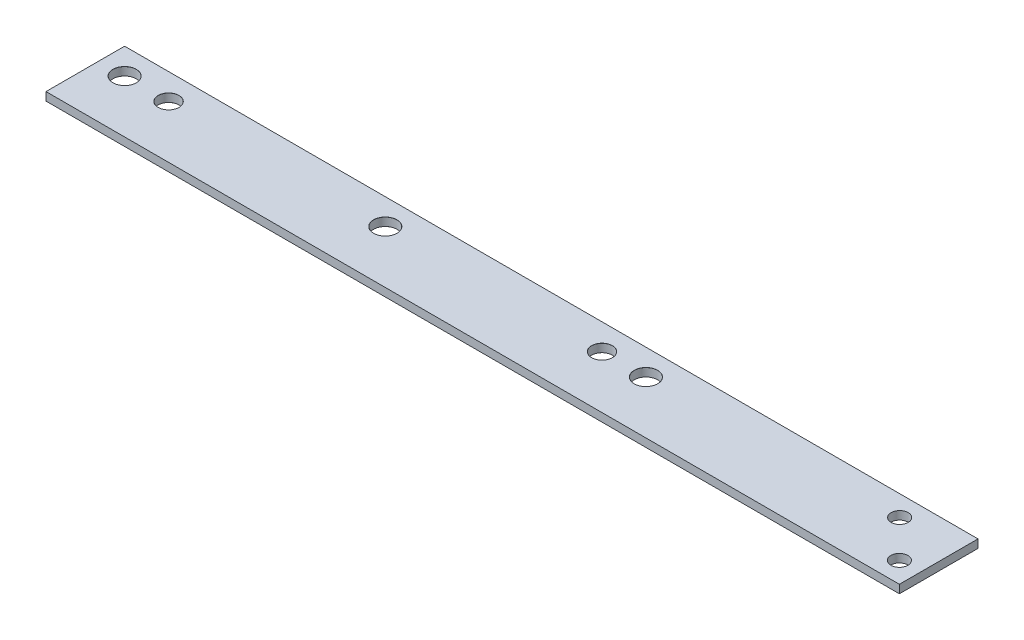
ISO-10303-21;
HEADER;
FILE_DESCRIPTION(('STEP AP214'),'2;1');
FILE_NAME('part.step','',(''),(''),'','','');
FILE_SCHEMA(('AUTOMOTIVE_DESIGN { 1 0 10303 214 1 1 1 1 }'));
ENDSEC;
DATA;
#1=APPLICATION_CONTEXT('core data for automotive mechanical design processes');
#2=APPLICATION_PROTOCOL_DEFINITION('international standard','automotive_design',2000,#1);
#3=PRODUCT_CONTEXT('',#1,'mechanical');
#4=PRODUCT('Part','Part','',(#3));
#5=PRODUCT_RELATED_PRODUCT_CATEGORY('part','',(#4));
#6=PRODUCT_DEFINITION_FORMATION('','',#4);
#7=PRODUCT_DEFINITION_CONTEXT('part definition',#1,'design');
#8=PRODUCT_DEFINITION('design','',#6,#7);
#9=PRODUCT_DEFINITION_SHAPE('','',#8);
#10=(LENGTH_UNIT() NAMED_UNIT(*) SI_UNIT(.MILLI.,.METRE.));
#11=(NAMED_UNIT(*) PLANE_ANGLE_UNIT() SI_UNIT($,.RADIAN.));
#12=(NAMED_UNIT(*) SI_UNIT($,.STERADIAN.) SOLID_ANGLE_UNIT());
#13=UNCERTAINTY_MEASURE_WITH_UNIT(LENGTH_MEASURE(1.E-05),#10,'distance_accuracy_value','');
#14=(GEOMETRIC_REPRESENTATION_CONTEXT(3) GLOBAL_UNCERTAINTY_ASSIGNED_CONTEXT((#13)) GLOBAL_UNIT_ASSIGNED_CONTEXT((#10,
#11,#12)) REPRESENTATION_CONTEXT('',''));
#15=CARTESIAN_POINT('',(0.,0.,0.));
#16=DIRECTION('',(0.,0.,1.));
#17=DIRECTION('',(1.,0.,0.));
#18=AXIS2_PLACEMENT_3D('',#15,#16,#17);
#19=CARTESIAN_POINT('',(165.,-3.2,-15.2));
#20=DIRECTION('',(1.,0.,0.));
#21=DIRECTION('',(0.,0.,-1.));
#22=AXIS2_PLACEMENT_3D('',#19,#20,#21);
#23=PLANE('',#22);
#24=DIRECTION('',(0.,0.,-1.));
#25=VECTOR('',#24,1.);
#26=CARTESIAN_POINT('',(165.,0.,-15.2));
#27=LINE('',#26,#25);
#28=CARTESIAN_POINT('',(165.,0.,15.2));
#29=VERTEX_POINT('',#28);
#30=CARTESIAN_POINT('',(165.,0.,-15.2));
#31=VERTEX_POINT('',#30);
#32=EDGE_CURVE('E115',#29,#31,#27,.T.);
#33=ORIENTED_EDGE('',*,*,#32,.F.);
#34=DIRECTION('',(0.,1.,0.));
#35=VECTOR('',#34,1.);
#36=CARTESIAN_POINT('',(165.,-3.2,15.2));
#37=LINE('',#36,#35);
#38=CARTESIAN_POINT('',(165.,-3.2,15.2));
#39=VERTEX_POINT('',#38);
#40=EDGE_CURVE('E11',#39,#29,#37,.T.);
#41=ORIENTED_EDGE('',*,*,#40,.F.);
#42=DIRECTION('',(0.,0.,-1.));
#43=VECTOR('',#42,1.);
#44=CARTESIAN_POINT('',(165.,-3.2,-15.2));
#45=LINE('',#44,#43);
#46=CARTESIAN_POINT('',(165.,-3.2,-15.2));
#47=VERTEX_POINT('',#46);
#48=EDGE_CURVE('E105',#39,#47,#45,.T.);
#49=ORIENTED_EDGE('',*,*,#48,.T.);
#50=DIRECTION('',(0.,1.,0.));
#51=VECTOR('',#50,1.);
#52=CARTESIAN_POINT('',(165.,-3.2,-15.2));
#53=LINE('',#52,#51);
#54=EDGE_CURVE('E46',#47,#31,#53,.T.);
#55=ORIENTED_EDGE('',*,*,#54,.T.);
#56=EDGE_LOOP('',(#33,#41,#49,#55));
#57=FACE_BOUND('',#56,.T.);
#58=ADVANCED_FACE('F43',(#57),#23,.T.);
#59=CARTESIAN_POINT('',(-165.,-3.2,15.2));
#60=DIRECTION('',(0.,0.,1.));
#61=DIRECTION('',(1.,0.,0.));
#62=AXIS2_PLACEMENT_3D('',#59,#60,#61);
#63=PLANE('',#62);
#64=DIRECTION('',(1.,0.,0.));
#65=VECTOR('',#64,1.);
#66=CARTESIAN_POINT('',(-165.,0.,15.2));
#67=LINE('',#66,#65);
#68=CARTESIAN_POINT('',(-165.,0.,15.2));
#69=VERTEX_POINT('',#68);
#70=EDGE_CURVE('E109',#69,#29,#67,.T.);
#71=ORIENTED_EDGE('',*,*,#70,.F.);
#72=DIRECTION('',(0.,1.,0.));
#73=VECTOR('',#72,1.);
#74=CARTESIAN_POINT('',(-165.,-3.2,15.2));
#75=LINE('',#74,#73);
#76=CARTESIAN_POINT('',(-165.,-3.2,15.2));
#77=VERTEX_POINT('',#76);
#78=EDGE_CURVE('E53',#77,#69,#75,.T.);
#79=ORIENTED_EDGE('',*,*,#78,.F.);
#80=DIRECTION('',(1.,0.,0.));
#81=VECTOR('',#80,1.);
#82=CARTESIAN_POINT('',(-165.,-3.2,15.2));
#83=LINE('',#82,#81);
#84=EDGE_CURVE('E100',#77,#39,#83,.T.);
#85=ORIENTED_EDGE('',*,*,#84,.T.);
#86=ORIENTED_EDGE('',*,*,#40,.T.);
#87=EDGE_LOOP('',(#71,#79,#85,#86));
#88=FACE_BOUND('',#87,.T.);
#89=ADVANCED_FACE('F138',(#88),#63,.T.);
#90=CARTESIAN_POINT('',(-165.,-3.2,-15.2));
#91=DIRECTION('',(-1.,0.,0.));
#92=DIRECTION('',(0.,0.,1.));
#93=AXIS2_PLACEMENT_3D('',#90,#91,#92);
#94=PLANE('',#93);
#95=DIRECTION('',(0.,0.,1.));
#96=VECTOR('',#95,1.);
#97=CARTESIAN_POINT('',(-165.,0.,-15.2));
#98=LINE('',#97,#96);
#99=CARTESIAN_POINT('',(-165.,0.,-15.2));
#100=VERTEX_POINT('',#99);
#101=EDGE_CURVE('E94',#100,#69,#98,.T.);
#102=ORIENTED_EDGE('',*,*,#101,.F.);
#103=DIRECTION('',(0.,1.,0.));
#104=VECTOR('',#103,1.);
#105=CARTESIAN_POINT('',(-165.,-3.2,-15.2));
#106=LINE('',#105,#104);
#107=CARTESIAN_POINT('',(-165.,-3.2,-15.2));
#108=VERTEX_POINT('',#107);
#109=EDGE_CURVE('E89',#108,#100,#106,.T.);
#110=ORIENTED_EDGE('',*,*,#109,.F.);
#111=DIRECTION('',(0.,0.,1.));
#112=VECTOR('',#111,1.);
#113=CARTESIAN_POINT('',(-165.,-3.2,-15.2));
#114=LINE('',#113,#112);
#115=EDGE_CURVE('E92',#108,#77,#114,.T.);
#116=ORIENTED_EDGE('',*,*,#115,.T.);
#117=ORIENTED_EDGE('',*,*,#78,.T.);
#118=EDGE_LOOP('',(#102,#110,#116,#117));
#119=FACE_BOUND('',#118,.T.);
#120=ADVANCED_FACE('F91',(#119),#94,.T.);
#121=CARTESIAN_POINT('',(-165.,-3.2,-15.2));
#122=DIRECTION('',(0.,0.,-1.));
#123=DIRECTION('',(-1.,0.,0.));
#124=AXIS2_PLACEMENT_3D('',#121,#122,#123);
#125=PLANE('',#124);
#126=DIRECTION('',(-1.,0.,0.));
#127=VECTOR('',#126,1.);
#128=CARTESIAN_POINT('',(-165.,0.,-15.2));
#129=LINE('',#128,#127);
#130=EDGE_CURVE('E119',#31,#100,#129,.T.);
#131=ORIENTED_EDGE('',*,*,#130,.F.);
#132=ORIENTED_EDGE('',*,*,#54,.F.);
#133=DIRECTION('',(-1.,0.,0.));
#134=VECTOR('',#133,1.);
#135=CARTESIAN_POINT('',(-165.,-3.2,-15.2));
#136=LINE('',#135,#134);
#137=EDGE_CURVE('E99',#47,#108,#136,.T.);
#138=ORIENTED_EDGE('',*,*,#137,.T.);
#139=ORIENTED_EDGE('',*,*,#109,.T.);
#140=EDGE_LOOP('',(#131,#132,#138,#139));
#141=FACE_BOUND('',#140,.T.);
#142=ADVANCED_FACE('F103',(#141),#125,.T.);
#143=CARTESIAN_POINT('',(0.,-3.2,0.));
#144=DIRECTION('',(0.,1.,0.));
#145=DIRECTION('',(0.,0.,1.));
#146=AXIS2_PLACEMENT_3D('',#143,#144,#145);
#147=PLANE('',#146);
#148=CARTESIAN_POINT('',(142.7,-3.2,-7.20000000000001));
#149=DIRECTION('',(0.,1.,0.));
#150=DIRECTION('',(0.,0.,1.));
#151=AXIS2_PLACEMENT_3D('',#148,#149,#150);
#152=CIRCLE('',#151,3.3);
#153=CARTESIAN_POINT('',(142.7,-3.2,-3.90000000000001));
#154=VERTEX_POINT('',#153);
#155=EDGE_CURVE('E231',#154,#154,#152,.T.);
#156=ORIENTED_EDGE('',*,*,#155,.T.);
#157=EDGE_LOOP('',(#156));
#158=FACE_BOUND('',#157,.T.);
#159=CARTESIAN_POINT('',(157.,-3.2,7.2));
#160=DIRECTION('',(0.,1.,0.));
#161=DIRECTION('',(0.,0.,1.));
#162=AXIS2_PLACEMENT_3D('',#159,#160,#161);
#163=CIRCLE('',#162,3.3);
#164=CARTESIAN_POINT('',(157.,-3.2,10.5));
#165=VERTEX_POINT('',#164);
#166=EDGE_CURVE('E245',#165,#165,#163,.T.);
#167=ORIENTED_EDGE('',*,*,#166,.T.);
#168=EDGE_LOOP('',(#167));
#169=FACE_BOUND('',#168,.T.);
#170=CARTESIAN_POINT('',(-138.,-3.2,-5.20000000000001));
#171=DIRECTION('',(0.,1.,0.));
#172=DIRECTION('',(0.,0.,1.));
#173=AXIS2_PLACEMENT_3D('',#170,#171,#172);
#174=CIRCLE('',#173,4.025);
#175=CARTESIAN_POINT('',(-138.,-3.2,-1.17500000000001));
#176=VERTEX_POINT('',#175);
#177=EDGE_CURVE('E249',#176,#176,#174,.T.);
#178=ORIENTED_EDGE('',*,*,#177,.T.);
#179=EDGE_LOOP('',(#178));
#180=FACE_BOUND('',#179,.T.);
#181=CARTESIAN_POINT('',(29.6,-3.2,-5.2));
#182=DIRECTION('',(0.,1.,0.));
#183=DIRECTION('',(0.,0.,1.));
#184=AXIS2_PLACEMENT_3D('',#181,#182,#183);
#185=CIRCLE('',#184,4.025);
#186=CARTESIAN_POINT('',(29.6,-3.2,-1.175));
#187=VERTEX_POINT('',#186);
#188=EDGE_CURVE('E265',#187,#187,#185,.T.);
#189=ORIENTED_EDGE('',*,*,#188,.T.);
#190=EDGE_LOOP('',(#189));
#191=FACE_BOUND('',#190,.T.);
#192=CARTESIAN_POINT('',(-155.,-3.2,-5.2));
#193=DIRECTION('',(0.,1.,0.));
#194=DIRECTION('',(0.,0.,1.));
#195=AXIS2_PLACEMENT_3D('',#192,#193,#194);
#196=CIRCLE('',#195,4.525);
#197=CARTESIAN_POINT('',(-155.,-3.2,-0.674999999999995));
#198=VERTEX_POINT('',#197);
#199=EDGE_CURVE('E281',#198,#198,#196,.T.);
#200=ORIENTED_EDGE('',*,*,#199,.T.);
#201=EDGE_LOOP('',(#200));
#202=FACE_BOUND('',#201,.T.);
#203=CARTESIAN_POINT('',(46.6,-3.2,-5.2));
#204=DIRECTION('',(0.,1.,0.));
#205=DIRECTION('',(0.,0.,1.));
#206=AXIS2_PLACEMENT_3D('',#203,#204,#205);
#207=CIRCLE('',#206,4.525);
#208=CARTESIAN_POINT('',(46.6,-3.2,-0.674999999999995));
#209=VERTEX_POINT('',#208);
#210=EDGE_CURVE('E297',#209,#209,#207,.T.);
#211=ORIENTED_EDGE('',*,*,#210,.T.);
#212=EDGE_LOOP('',(#211));
#213=FACE_BOUND('',#212,.T.);
#214=CARTESIAN_POINT('',(-54.2,-3.2,-5.2));
#215=DIRECTION('',(0.,1.,0.));
#216=DIRECTION('',(0.,0.,1.));
#217=AXIS2_PLACEMENT_3D('',#214,#215,#216);
#218=CIRCLE('',#217,4.525);
#219=CARTESIAN_POINT('',(-54.2,-3.2,-0.674999999999995));
#220=VERTEX_POINT('',#219);
#221=EDGE_CURVE('E313',#220,#220,#218,.T.);
#222=ORIENTED_EDGE('',*,*,#221,.T.);
#223=EDGE_LOOP('',(#222));
#224=FACE_BOUND('',#223,.T.);
#225=ORIENTED_EDGE('',*,*,#48,.F.);
#226=ORIENTED_EDGE('',*,*,#84,.F.);
#227=ORIENTED_EDGE('',*,*,#115,.F.);
#228=ORIENTED_EDGE('',*,*,#137,.F.);
#229=EDGE_LOOP('',(#225,#226,#227,#228));
#230=FACE_BOUND('',#229,.T.);
#231=ADVANCED_FACE('F98',(#158,#169,#180,#191,#202,#213,#224,#230),#147,.F.);
#232=CARTESIAN_POINT('',(0.,0.,0.));
#233=DIRECTION('',(0.,1.,0.));
#234=DIRECTION('',(0.,0.,1.));
#235=AXIS2_PLACEMENT_3D('',#232,#233,#234);
#236=PLANE('',#235);
#237=CARTESIAN_POINT('',(142.7,0.,-7.20000000000001));
#238=DIRECTION('',(0.,1.,0.));
#239=DIRECTION('',(0.,0.,1.));
#240=AXIS2_PLACEMENT_3D('',#237,#238,#239);
#241=CIRCLE('',#240,3.3);
#242=CARTESIAN_POINT('',(142.7,0.,-3.90000000000001));
#243=VERTEX_POINT('',#242);
#244=EDGE_CURVE('E234',#243,#243,#241,.T.);
#245=ORIENTED_EDGE('',*,*,#244,.F.);
#246=EDGE_LOOP('',(#245));
#247=FACE_BOUND('',#246,.T.);
#248=CARTESIAN_POINT('',(157.,0.,7.2));
#249=DIRECTION('',(0.,1.,0.));
#250=DIRECTION('',(0.,0.,1.));
#251=AXIS2_PLACEMENT_3D('',#248,#249,#250);
#252=CIRCLE('',#251,3.3);
#253=CARTESIAN_POINT('',(157.,0.,10.5));
#254=VERTEX_POINT('',#253);
#255=EDGE_CURVE('E239',#254,#254,#252,.T.);
#256=ORIENTED_EDGE('',*,*,#255,.F.);
#257=EDGE_LOOP('',(#256));
#258=FACE_BOUND('',#257,.T.);
#259=CARTESIAN_POINT('',(-138.,0.,-5.20000000000001));
#260=DIRECTION('',(0.,1.,0.));
#261=DIRECTION('',(0.,0.,1.));
#262=AXIS2_PLACEMENT_3D('',#259,#260,#261);
#263=CIRCLE('',#262,4.025);
#264=CARTESIAN_POINT('',(-138.,0.,-1.17500000000001));
#265=VERTEX_POINT('',#264);
#266=EDGE_CURVE('E253',#265,#265,#263,.T.);
#267=ORIENTED_EDGE('',*,*,#266,.F.);
#268=EDGE_LOOP('',(#267));
#269=FACE_BOUND('',#268,.T.);
#270=CARTESIAN_POINT('',(29.6,0.,-5.2));
#271=DIRECTION('',(0.,1.,0.));
#272=DIRECTION('',(0.,0.,1.));
#273=AXIS2_PLACEMENT_3D('',#270,#271,#272);
#274=CIRCLE('',#273,4.025);
#275=CARTESIAN_POINT('',(29.6,0.,-1.175));
#276=VERTEX_POINT('',#275);
#277=EDGE_CURVE('E269',#276,#276,#274,.T.);
#278=ORIENTED_EDGE('',*,*,#277,.F.);
#279=EDGE_LOOP('',(#278));
#280=FACE_BOUND('',#279,.T.);
#281=CARTESIAN_POINT('',(-155.,0.,-5.2));
#282=DIRECTION('',(0.,1.,0.));
#283=DIRECTION('',(0.,0.,1.));
#284=AXIS2_PLACEMENT_3D('',#281,#282,#283);
#285=CIRCLE('',#284,4.525);
#286=CARTESIAN_POINT('',(-155.,0.,-0.674999999999995));
#287=VERTEX_POINT('',#286);
#288=EDGE_CURVE('E285',#287,#287,#285,.T.);
#289=ORIENTED_EDGE('',*,*,#288,.F.);
#290=EDGE_LOOP('',(#289));
#291=FACE_BOUND('',#290,.T.);
#292=CARTESIAN_POINT('',(46.6,0.,-5.2));
#293=DIRECTION('',(0.,1.,0.));
#294=DIRECTION('',(0.,0.,1.));
#295=AXIS2_PLACEMENT_3D('',#292,#293,#294);
#296=CIRCLE('',#295,4.525);
#297=CARTESIAN_POINT('',(46.6,0.,-0.674999999999995));
#298=VERTEX_POINT('',#297);
#299=EDGE_CURVE('E301',#298,#298,#296,.T.);
#300=ORIENTED_EDGE('',*,*,#299,.F.);
#301=EDGE_LOOP('',(#300));
#302=FACE_BOUND('',#301,.T.);
#303=CARTESIAN_POINT('',(-54.2,0.,-5.2));
#304=DIRECTION('',(0.,1.,0.));
#305=DIRECTION('',(0.,0.,1.));
#306=AXIS2_PLACEMENT_3D('',#303,#304,#305);
#307=CIRCLE('',#306,4.525);
#308=CARTESIAN_POINT('',(-54.2,0.,-0.674999999999995));
#309=VERTEX_POINT('',#308);
#310=EDGE_CURVE('E317',#309,#309,#307,.T.);
#311=ORIENTED_EDGE('',*,*,#310,.F.);
#312=EDGE_LOOP('',(#311));
#313=FACE_BOUND('',#312,.T.);
#314=ORIENTED_EDGE('',*,*,#32,.T.);
#315=ORIENTED_EDGE('',*,*,#130,.T.);
#316=ORIENTED_EDGE('',*,*,#101,.T.);
#317=ORIENTED_EDGE('',*,*,#70,.T.);
#318=EDGE_LOOP('',(#314,#315,#316,#317));
#319=FACE_BOUND('',#318,.T.);
#320=ADVANCED_FACE('F137',(#247,#258,#269,#280,#291,#302,#313,#319),#236,.T.);
#321=CARTESIAN_POINT('',(-54.2,-3.175,-5.2));
#322=DIRECTION('',(0.,-1.,0.));
#323=DIRECTION('',(0.,0.,-1.));
#324=AXIS2_PLACEMENT_3D('',#321,#322,#323);
#325=CONICAL_SURFACE('',#324,4.5,0.785398163397388);
#326=ORIENTED_EDGE('',*,*,#221,.F.);
#327=EDGE_LOOP('',(#326));
#328=FACE_BOUND('',#327,.T.);
#329=CARTESIAN_POINT('',(-54.2,-3.175,-5.2));
#330=DIRECTION('',(0.,1.,0.));
#331=DIRECTION('',(0.,0.,1.));
#332=AXIS2_PLACEMENT_3D('',#329,#330,#331);
#333=CIRCLE('',#332,4.5);
#334=CARTESIAN_POINT('',(-54.2,-3.175,-0.699999999999992));
#335=VERTEX_POINT('',#334);
#336=EDGE_CURVE('E120',#335,#335,#333,.T.);
#337=ORIENTED_EDGE('',*,*,#336,.T.);
#338=EDGE_LOOP('',(#337));
#339=FACE_BOUND('',#338,.T.);
#340=ADVANCED_FACE('F158',(#328,#339),#325,.F.);
#341=CARTESIAN_POINT('',(-54.2,0.,-5.2));
#342=DIRECTION('',(0.,1.,0.));
#343=DIRECTION('',(0.,0.,1.));
#344=AXIS2_PLACEMENT_3D('',#341,#342,#343);
#345=CYLINDRICAL_SURFACE('',#344,4.5);
#346=ORIENTED_EDGE('',*,*,#336,.F.);
#347=EDGE_LOOP('',(#346));
#348=FACE_BOUND('',#347,.T.);
#349=CARTESIAN_POINT('',(-54.2,-0.0249999999999972,-5.2));
#350=DIRECTION('',(0.,1.,0.));
#351=DIRECTION('',(0.,0.,1.));
#352=AXIS2_PLACEMENT_3D('',#349,#350,#351);
#353=CIRCLE('',#352,4.5);
#354=CARTESIAN_POINT('',(-54.2,-0.0249999999999972,-0.699999999999992));
#355=VERTEX_POINT('',#354);
#356=EDGE_CURVE('E321',#355,#355,#353,.T.);
#357=ORIENTED_EDGE('',*,*,#356,.T.);
#358=EDGE_LOOP('',(#357));
#359=FACE_BOUND('',#358,.T.);
#360=ADVANCED_FACE('F164',(#348,#359),#345,.F.);
#361=CARTESIAN_POINT('',(-54.2,0.,-5.2));
#362=DIRECTION('',(0.,1.,0.));
#363=DIRECTION('',(0.,0.,1.));
#364=AXIS2_PLACEMENT_3D('',#361,#362,#363);
#365=CONICAL_SURFACE('',#364,4.525,0.785398163397448);
#366=ORIENTED_EDGE('',*,*,#356,.F.);
#367=EDGE_LOOP('',(#366));
#368=FACE_BOUND('',#367,.T.);
#369=ORIENTED_EDGE('',*,*,#310,.T.);
#370=EDGE_LOOP('',(#369));
#371=FACE_BOUND('',#370,.T.);
#372=ADVANCED_FACE('F168',(#368,#371),#365,.F.);
#373=CARTESIAN_POINT('',(46.6,-3.175,-5.2));
#374=DIRECTION('',(0.,-1.,0.));
#375=DIRECTION('',(0.,0.,-1.));
#376=AXIS2_PLACEMENT_3D('',#373,#374,#375);
#377=CONICAL_SURFACE('',#376,4.5,0.785398163397388);
#378=ORIENTED_EDGE('',*,*,#210,.F.);
#379=EDGE_LOOP('',(#378));
#380=FACE_BOUND('',#379,.T.);
#381=CARTESIAN_POINT('',(46.6,-3.175,-5.2));
#382=DIRECTION('',(0.,1.,0.));
#383=DIRECTION('',(0.,0.,1.));
#384=AXIS2_PLACEMENT_3D('',#381,#382,#383);
#385=CIRCLE('',#384,4.5);
#386=CARTESIAN_POINT('',(46.6,-3.175,-0.699999999999992));
#387=VERTEX_POINT('',#386);
#388=EDGE_CURVE('E309',#387,#387,#385,.T.);
#389=ORIENTED_EDGE('',*,*,#388,.T.);
#390=EDGE_LOOP('',(#389));
#391=FACE_BOUND('',#390,.T.);
#392=ADVANCED_FACE('F172',(#380,#391),#377,.F.);
#393=CARTESIAN_POINT('',(46.6,0.,-5.2));
#394=DIRECTION('',(0.,1.,0.));
#395=DIRECTION('',(0.,0.,1.));
#396=AXIS2_PLACEMENT_3D('',#393,#394,#395);
#397=CYLINDRICAL_SURFACE('',#396,4.5);
#398=ORIENTED_EDGE('',*,*,#388,.F.);
#399=EDGE_LOOP('',(#398));
#400=FACE_BOUND('',#399,.T.);
#401=CARTESIAN_POINT('',(46.6,-0.0249999999999972,-5.2));
#402=DIRECTION('',(0.,1.,0.));
#403=DIRECTION('',(0.,0.,1.));
#404=AXIS2_PLACEMENT_3D('',#401,#402,#403);
#405=CIRCLE('',#404,4.5);
#406=CARTESIAN_POINT('',(46.6,-0.0249999999999972,-0.699999999999992));
#407=VERTEX_POINT('',#406);
#408=EDGE_CURVE('E305',#407,#407,#405,.T.);
#409=ORIENTED_EDGE('',*,*,#408,.T.);
#410=EDGE_LOOP('',(#409));
#411=FACE_BOUND('',#410,.T.);
#412=ADVANCED_FACE('F176',(#400,#411),#397,.F.);
#413=CARTESIAN_POINT('',(46.6,0.,-5.2));
#414=DIRECTION('',(0.,1.,0.));
#415=DIRECTION('',(0.,0.,1.));
#416=AXIS2_PLACEMENT_3D('',#413,#414,#415);
#417=CONICAL_SURFACE('',#416,4.525,0.785398163397448);
#418=ORIENTED_EDGE('',*,*,#408,.F.);
#419=EDGE_LOOP('',(#418));
#420=FACE_BOUND('',#419,.T.);
#421=ORIENTED_EDGE('',*,*,#299,.T.);
#422=EDGE_LOOP('',(#421));
#423=FACE_BOUND('',#422,.T.);
#424=ADVANCED_FACE('F180',(#420,#423),#417,.F.);
#425=CARTESIAN_POINT('',(-155.,-3.175,-5.2));
#426=DIRECTION('',(0.,-1.,0.));
#427=DIRECTION('',(0.,0.,-1.));
#428=AXIS2_PLACEMENT_3D('',#425,#426,#427);
#429=CONICAL_SURFACE('',#428,4.5,0.785398163397388);
#430=ORIENTED_EDGE('',*,*,#199,.F.);
#431=EDGE_LOOP('',(#430));
#432=FACE_BOUND('',#431,.T.);
#433=CARTESIAN_POINT('',(-155.,-3.175,-5.2));
#434=DIRECTION('',(0.,1.,0.));
#435=DIRECTION('',(0.,0.,1.));
#436=AXIS2_PLACEMENT_3D('',#433,#434,#435);
#437=CIRCLE('',#436,4.5);
#438=CARTESIAN_POINT('',(-155.,-3.175,-0.699999999999992));
#439=VERTEX_POINT('',#438);
#440=EDGE_CURVE('E293',#439,#439,#437,.T.);
#441=ORIENTED_EDGE('',*,*,#440,.T.);
#442=EDGE_LOOP('',(#441));
#443=FACE_BOUND('',#442,.T.);
#444=ADVANCED_FACE('F184',(#432,#443),#429,.F.);
#445=CARTESIAN_POINT('',(-155.,0.,-5.2));
#446=DIRECTION('',(0.,1.,0.));
#447=DIRECTION('',(0.,0.,1.));
#448=AXIS2_PLACEMENT_3D('',#445,#446,#447);
#449=CYLINDRICAL_SURFACE('',#448,4.5);
#450=ORIENTED_EDGE('',*,*,#440,.F.);
#451=EDGE_LOOP('',(#450));
#452=FACE_BOUND('',#451,.T.);
#453=CARTESIAN_POINT('',(-155.,-0.0249999999999972,-5.2));
#454=DIRECTION('',(0.,1.,0.));
#455=DIRECTION('',(0.,0.,1.));
#456=AXIS2_PLACEMENT_3D('',#453,#454,#455);
#457=CIRCLE('',#456,4.5);
#458=CARTESIAN_POINT('',(-155.,-0.0249999999999972,-0.699999999999992));
#459=VERTEX_POINT('',#458);
#460=EDGE_CURVE('E289',#459,#459,#457,.T.);
#461=ORIENTED_EDGE('',*,*,#460,.T.);
#462=EDGE_LOOP('',(#461));
#463=FACE_BOUND('',#462,.T.);
#464=ADVANCED_FACE('F188',(#452,#463),#449,.F.);
#465=CARTESIAN_POINT('',(-155.,0.,-5.2));
#466=DIRECTION('',(0.,1.,0.));
#467=DIRECTION('',(0.,0.,1.));
#468=AXIS2_PLACEMENT_3D('',#465,#466,#467);
#469=CONICAL_SURFACE('',#468,4.525,0.785398163397448);
#470=ORIENTED_EDGE('',*,*,#460,.F.);
#471=EDGE_LOOP('',(#470));
#472=FACE_BOUND('',#471,.T.);
#473=ORIENTED_EDGE('',*,*,#288,.T.);
#474=EDGE_LOOP('',(#473));
#475=FACE_BOUND('',#474,.T.);
#476=ADVANCED_FACE('F192',(#472,#475),#469,.F.);
#477=CARTESIAN_POINT('',(29.6,-3.17499999999999,-5.2));
#478=DIRECTION('',(0.,-1.,0.));
#479=DIRECTION('',(0.,0.,-1.));
#480=AXIS2_PLACEMENT_3D('',#477,#478,#479);
#481=CONICAL_SURFACE('',#480,4.,0.785398163397379);
#482=ORIENTED_EDGE('',*,*,#188,.F.);
#483=EDGE_LOOP('',(#482));
#484=FACE_BOUND('',#483,.T.);
#485=CARTESIAN_POINT('',(29.6,-3.17499999999999,-5.2));
#486=DIRECTION('',(0.,1.,0.));
#487=DIRECTION('',(0.,0.,1.));
#488=AXIS2_PLACEMENT_3D('',#485,#486,#487);
#489=CIRCLE('',#488,4.);
#490=CARTESIAN_POINT('',(29.6,-3.17499999999999,-1.2));
#491=VERTEX_POINT('',#490);
#492=EDGE_CURVE('E277',#491,#491,#489,.T.);
#493=ORIENTED_EDGE('',*,*,#492,.T.);
#494=EDGE_LOOP('',(#493));
#495=FACE_BOUND('',#494,.T.);
#496=ADVANCED_FACE('F196',(#484,#495),#481,.F.);
#497=CARTESIAN_POINT('',(29.6,0.,-5.2));
#498=DIRECTION('',(0.,1.,0.));
#499=DIRECTION('',(0.,0.,1.));
#500=AXIS2_PLACEMENT_3D('',#497,#498,#499);
#501=CYLINDRICAL_SURFACE('',#500,3.99999999999999);
#502=ORIENTED_EDGE('',*,*,#492,.F.);
#503=EDGE_LOOP('',(#502));
#504=FACE_BOUND('',#503,.T.);
#505=CARTESIAN_POINT('',(29.6,-0.025000000000025,-5.2));
#506=DIRECTION('',(0.,1.,0.));
#507=DIRECTION('',(0.,0.,1.));
#508=AXIS2_PLACEMENT_3D('',#505,#506,#507);
#509=CIRCLE('',#508,3.99999999999999);
#510=CARTESIAN_POINT('',(29.6,-0.025000000000025,-1.20000000000001));
#511=VERTEX_POINT('',#510);
#512=EDGE_CURVE('E273',#511,#511,#509,.T.);
#513=ORIENTED_EDGE('',*,*,#512,.T.);
#514=EDGE_LOOP('',(#513));
#515=FACE_BOUND('',#514,.T.);
#516=ADVANCED_FACE('F200',(#504,#515),#501,.F.);
#517=CARTESIAN_POINT('',(29.6,0.,-5.2));
#518=DIRECTION('',(0.,1.,0.));
#519=DIRECTION('',(0.,0.,1.));
#520=AXIS2_PLACEMENT_3D('',#517,#518,#519);
#521=CONICAL_SURFACE('',#520,4.025,0.785398163397136);
#522=ORIENTED_EDGE('',*,*,#512,.F.);
#523=EDGE_LOOP('',(#522));
#524=FACE_BOUND('',#523,.T.);
#525=ORIENTED_EDGE('',*,*,#277,.T.);
#526=EDGE_LOOP('',(#525));
#527=FACE_BOUND('',#526,.T.);
#528=ADVANCED_FACE('F204',(#524,#527),#521,.F.);
#529=CARTESIAN_POINT('',(-138.,-3.17499999999999,-5.20000000000001));
#530=DIRECTION('',(0.,-1.,0.));
#531=DIRECTION('',(0.,0.,-1.));
#532=AXIS2_PLACEMENT_3D('',#529,#530,#531);
#533=CONICAL_SURFACE('',#532,4.,0.78539816339724);
#534=ORIENTED_EDGE('',*,*,#177,.F.);
#535=EDGE_LOOP('',(#534));
#536=FACE_BOUND('',#535,.T.);
#537=CARTESIAN_POINT('',(-138.,-3.17499999999999,-5.20000000000001));
#538=DIRECTION('',(0.,1.,0.));
#539=DIRECTION('',(0.,0.,1.));
#540=AXIS2_PLACEMENT_3D('',#537,#538,#539);
#541=CIRCLE('',#540,4.);
#542=CARTESIAN_POINT('',(-138.,-3.17499999999999,-1.20000000000001));
#543=VERTEX_POINT('',#542);
#544=EDGE_CURVE('E261',#543,#543,#541,.T.);
#545=ORIENTED_EDGE('',*,*,#544,.T.);
#546=EDGE_LOOP('',(#545));
#547=FACE_BOUND('',#546,.T.);
#548=ADVANCED_FACE('F208',(#536,#547),#533,.F.);
#549=CARTESIAN_POINT('',(-138.,0.,-5.20000000000001));
#550=DIRECTION('',(0.,1.,0.));
#551=DIRECTION('',(0.,0.,1.));
#552=AXIS2_PLACEMENT_3D('',#549,#550,#551);
#553=CYLINDRICAL_SURFACE('',#552,3.99999999999999);
#554=ORIENTED_EDGE('',*,*,#544,.F.);
#555=EDGE_LOOP('',(#554));
#556=FACE_BOUND('',#555,.T.);
#557=CARTESIAN_POINT('',(-138.,-0.025000000000025,-5.20000000000001));
#558=DIRECTION('',(0.,1.,0.));
#559=DIRECTION('',(0.,0.,1.));
#560=AXIS2_PLACEMENT_3D('',#557,#558,#559);
#561=CIRCLE('',#560,3.99999999999998);
#562=CARTESIAN_POINT('',(-138.,-0.025000000000025,-1.20000000000003));
#563=VERTEX_POINT('',#562);
#564=EDGE_CURVE('E257',#563,#563,#561,.T.);
#565=ORIENTED_EDGE('',*,*,#564,.T.);
#566=EDGE_LOOP('',(#565));
#567=FACE_BOUND('',#566,.T.);
#568=ADVANCED_FACE('F212',(#556,#567),#553,.F.);
#569=CARTESIAN_POINT('',(-138.,0.,-5.20000000000001));
#570=DIRECTION('',(0.,1.,0.));
#571=DIRECTION('',(0.,0.,1.));
#572=AXIS2_PLACEMENT_3D('',#569,#570,#571);
#573=CONICAL_SURFACE('',#572,4.025,0.785398163397414);
#574=ORIENTED_EDGE('',*,*,#564,.F.);
#575=EDGE_LOOP('',(#574));
#576=FACE_BOUND('',#575,.T.);
#577=ORIENTED_EDGE('',*,*,#266,.T.);
#578=EDGE_LOOP('',(#577));
#579=FACE_BOUND('',#578,.T.);
#580=ADVANCED_FACE('F216',(#576,#579),#573,.F.);
#581=CARTESIAN_POINT('',(157.,0.,7.2));
#582=DIRECTION('',(0.,1.,0.));
#583=DIRECTION('',(0.,0.,1.));
#584=AXIS2_PLACEMENT_3D('',#581,#582,#583);
#585=CYLINDRICAL_SURFACE('',#584,3.3);
#586=ORIENTED_EDGE('',*,*,#166,.F.);
#587=EDGE_LOOP('',(#586));
#588=FACE_BOUND('',#587,.T.);
#589=ORIENTED_EDGE('',*,*,#255,.T.);
#590=EDGE_LOOP('',(#589));
#591=FACE_BOUND('',#590,.T.);
#592=ADVANCED_FACE('F219',(#588,#591),#585,.F.);
#593=CARTESIAN_POINT('',(142.7,0.,-7.20000000000001));
#594=DIRECTION('',(0.,1.,0.));
#595=DIRECTION('',(0.,0.,1.));
#596=AXIS2_PLACEMENT_3D('',#593,#594,#595);
#597=CYLINDRICAL_SURFACE('',#596,3.3);
#598=ORIENTED_EDGE('',*,*,#155,.F.);
#599=EDGE_LOOP('',(#598));
#600=FACE_BOUND('',#599,.T.);
#601=ORIENTED_EDGE('',*,*,#244,.T.);
#602=EDGE_LOOP('',(#601));
#603=FACE_BOUND('',#602,.T.);
#604=ADVANCED_FACE('F223',(#600,#603),#597,.F.);
#605=CLOSED_SHELL('',(#58,#89,#120,#142,#231,#320,#340,#360,#372,#392,#412,#424,#444,#464,#476,
#496,#516,#528,#548,#568,#580,#592,#604));
#606=MANIFOLD_SOLID_BREP('B2',#605);
#607=ADVANCED_BREP_SHAPE_REPRESENTATION('',(#18,#606),#14);
#608=SHAPE_DEFINITION_REPRESENTATION(#9,#607);
ENDSEC;
END-ISO-10303-21;
